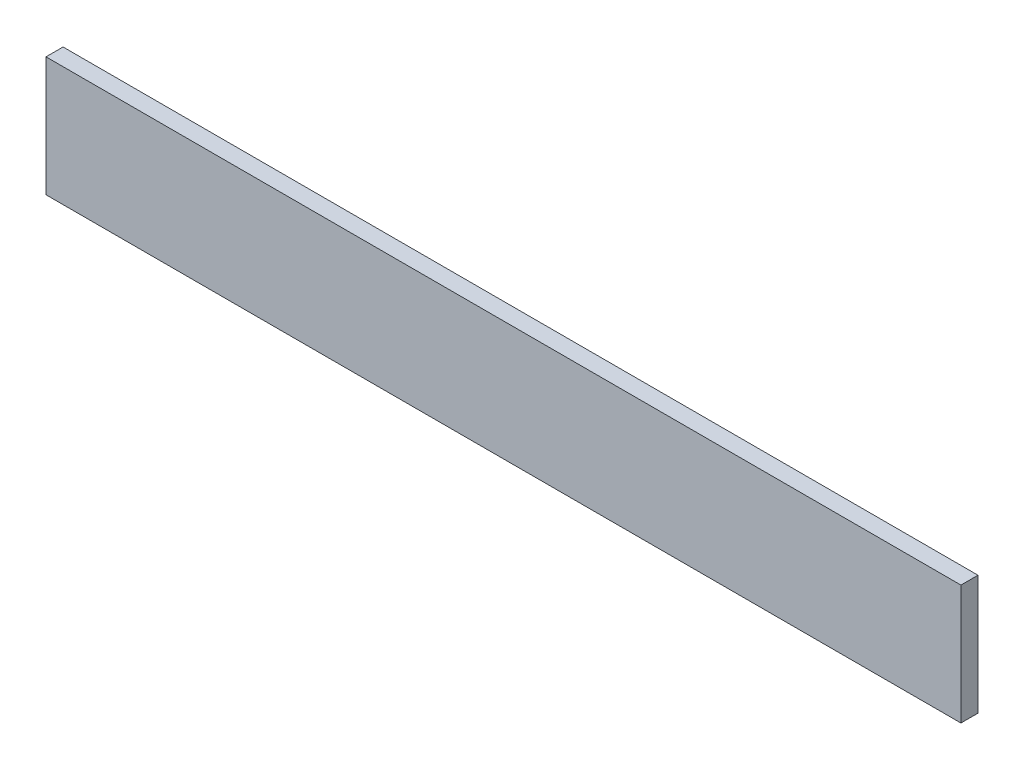
ISO-10303-21;
HEADER;
FILE_DESCRIPTION(('STEP AP214'),'2;1');
FILE_NAME('part.step','',(''),(''),'','','');
FILE_SCHEMA(('AUTOMOTIVE_DESIGN { 1 0 10303 214 1 1 1 1 }'));
ENDSEC;
DATA;
#1=APPLICATION_CONTEXT('core data for automotive mechanical design processes');
#2=APPLICATION_PROTOCOL_DEFINITION('international standard','automotive_design',2000,#1);
#3=PRODUCT_CONTEXT('',#1,'mechanical');
#4=PRODUCT('Part','Part','',(#3));
#5=PRODUCT_RELATED_PRODUCT_CATEGORY('part','',(#4));
#6=PRODUCT_DEFINITION_FORMATION('','',#4);
#7=PRODUCT_DEFINITION_CONTEXT('part definition',#1,'design');
#8=PRODUCT_DEFINITION('design','',#6,#7);
#9=PRODUCT_DEFINITION_SHAPE('','',#8);
#10=(LENGTH_UNIT() NAMED_UNIT(*) SI_UNIT(.MILLI.,.METRE.));
#11=(NAMED_UNIT(*) PLANE_ANGLE_UNIT() SI_UNIT($,.RADIAN.));
#12=(NAMED_UNIT(*) SI_UNIT($,.STERADIAN.) SOLID_ANGLE_UNIT());
#13=UNCERTAINTY_MEASURE_WITH_UNIT(LENGTH_MEASURE(1.E-05),#10,'distance_accuracy_value','');
#14=(GEOMETRIC_REPRESENTATION_CONTEXT(3) GLOBAL_UNCERTAINTY_ASSIGNED_CONTEXT((#13)) GLOBAL_UNIT_ASSIGNED_CONTEXT((#10,
#11,#12)) REPRESENTATION_CONTEXT('',''));
#15=CARTESIAN_POINT('',(0.,0.,0.));
#16=DIRECTION('',(0.,0.,1.));
#17=DIRECTION('',(1.,0.,0.));
#18=AXIS2_PLACEMENT_3D('',#15,#16,#17);
#19=CARTESIAN_POINT('',(268.,35.,-10.));
#20=DIRECTION('',(1.,0.,0.));
#21=DIRECTION('',(0.,0.,-1.));
#22=AXIS2_PLACEMENT_3D('',#19,#20,#21);
#23=PLANE('',#22);
#24=DIRECTION('',(0.,1.,0.));
#25=VECTOR('',#24,1.);
#26=CARTESIAN_POINT('',(268.,35.,0.));
#27=LINE('',#26,#25);
#28=CARTESIAN_POINT('',(268.,-35.,0.));
#29=VERTEX_POINT('',#28);
#30=CARTESIAN_POINT('',(268.,35.,0.));
#31=VERTEX_POINT('',#30);
#32=EDGE_CURVE('E100',#29,#31,#27,.T.);
#33=ORIENTED_EDGE('',*,*,#32,.F.);
#34=DIRECTION('',(0.,0.,1.));
#35=VECTOR('',#34,1.);
#36=CARTESIAN_POINT('',(268.,-35.,-10.));
#37=LINE('',#36,#35);
#38=CARTESIAN_POINT('',(268.,-35.,-10.));
#39=VERTEX_POINT('',#38);
#40=EDGE_CURVE('E11',#39,#29,#37,.T.);
#41=ORIENTED_EDGE('',*,*,#40,.F.);
#42=DIRECTION('',(0.,1.,0.));
#43=VECTOR('',#42,1.);
#44=CARTESIAN_POINT('',(268.,35.,-10.));
#45=LINE('',#44,#43);
#46=CARTESIAN_POINT('',(268.,35.,-10.));
#47=VERTEX_POINT('',#46);
#48=EDGE_CURVE('E94',#39,#47,#45,.T.);
#49=ORIENTED_EDGE('',*,*,#48,.T.);
#50=DIRECTION('',(0.,0.,1.));
#51=VECTOR('',#50,1.);
#52=CARTESIAN_POINT('',(268.,35.,-10.));
#53=LINE('',#52,#51);
#54=EDGE_CURVE('E39',#47,#31,#53,.T.);
#55=ORIENTED_EDGE('',*,*,#54,.T.);
#56=EDGE_LOOP('',(#33,#41,#49,#55));
#57=FACE_BOUND('',#56,.T.);
#58=ADVANCED_FACE('F36',(#57),#23,.T.);
#59=CARTESIAN_POINT('',(-268.,-35.,-10.));
#60=DIRECTION('',(0.,-1.,0.));
#61=DIRECTION('',(0.,0.,-1.));
#62=AXIS2_PLACEMENT_3D('',#59,#60,#61);
#63=PLANE('',#62);
#64=DIRECTION('',(1.,0.,0.));
#65=VECTOR('',#64,1.);
#66=CARTESIAN_POINT('',(-268.,-35.,0.));
#67=LINE('',#66,#65);
#68=CARTESIAN_POINT('',(-268.,-35.,0.));
#69=VERTEX_POINT('',#68);
#70=EDGE_CURVE('E96',#69,#29,#67,.T.);
#71=ORIENTED_EDGE('',*,*,#70,.F.);
#72=DIRECTION('',(0.,0.,1.));
#73=VECTOR('',#72,1.);
#74=CARTESIAN_POINT('',(-268.,-35.,-10.));
#75=LINE('',#74,#73);
#76=CARTESIAN_POINT('',(-268.,-35.,-10.));
#77=VERTEX_POINT('',#76);
#78=EDGE_CURVE('E45',#77,#69,#75,.T.);
#79=ORIENTED_EDGE('',*,*,#78,.F.);
#80=DIRECTION('',(1.,0.,0.));
#81=VECTOR('',#80,1.);
#82=CARTESIAN_POINT('',(-268.,-35.,-10.));
#83=LINE('',#82,#81);
#84=EDGE_CURVE('E91',#77,#39,#83,.T.);
#85=ORIENTED_EDGE('',*,*,#84,.T.);
#86=ORIENTED_EDGE('',*,*,#40,.T.);
#87=EDGE_LOOP('',(#71,#79,#85,#86));
#88=FACE_BOUND('',#87,.T.);
#89=ADVANCED_FACE('F110',(#88),#63,.T.);
#90=CARTESIAN_POINT('',(-268.,35.,-10.));
#91=DIRECTION('',(-1.,0.,0.));
#92=DIRECTION('',(0.,-1.,0.));
#93=AXIS2_PLACEMENT_3D('',#90,#91,#92);
#94=PLANE('',#93);
#95=DIRECTION('',(0.,-1.,0.));
#96=VECTOR('',#95,1.);
#97=CARTESIAN_POINT('',(-268.,35.,0.));
#98=LINE('',#97,#96);
#99=CARTESIAN_POINT('',(-268.,35.,0.));
#100=VERTEX_POINT('',#99);
#101=EDGE_CURVE('E86',#100,#69,#98,.T.);
#102=ORIENTED_EDGE('',*,*,#101,.F.);
#103=DIRECTION('',(0.,0.,1.));
#104=VECTOR('',#103,1.);
#105=CARTESIAN_POINT('',(-268.,35.,-10.));
#106=LINE('',#105,#104);
#107=CARTESIAN_POINT('',(-268.,35.,-10.));
#108=VERTEX_POINT('',#107);
#109=EDGE_CURVE('E81',#108,#100,#106,.T.);
#110=ORIENTED_EDGE('',*,*,#109,.F.);
#111=DIRECTION('',(0.,-1.,0.));
#112=VECTOR('',#111,1.);
#113=CARTESIAN_POINT('',(-268.,35.,-10.));
#114=LINE('',#113,#112);
#115=EDGE_CURVE('E84',#108,#77,#114,.T.);
#116=ORIENTED_EDGE('',*,*,#115,.T.);
#117=ORIENTED_EDGE('',*,*,#78,.T.);
#118=EDGE_LOOP('',(#102,#110,#116,#117));
#119=FACE_BOUND('',#118,.T.);
#120=ADVANCED_FACE('F83',(#119),#94,.T.);
#121=CARTESIAN_POINT('',(-268.,35.,-10.));
#122=DIRECTION('',(0.,1.,0.));
#123=DIRECTION('',(0.,0.,1.));
#124=AXIS2_PLACEMENT_3D('',#121,#122,#123);
#125=PLANE('',#124);
#126=DIRECTION('',(-1.,0.,0.));
#127=VECTOR('',#126,1.);
#128=CARTESIAN_POINT('',(-268.,35.,0.));
#129=LINE('',#128,#127);
#130=EDGE_CURVE('E103',#31,#100,#129,.T.);
#131=ORIENTED_EDGE('',*,*,#130,.F.);
#132=ORIENTED_EDGE('',*,*,#54,.F.);
#133=DIRECTION('',(-1.,0.,0.));
#134=VECTOR('',#133,1.);
#135=CARTESIAN_POINT('',(-268.,35.,-10.));
#136=LINE('',#135,#134);
#137=EDGE_CURVE('E90',#47,#108,#136,.T.);
#138=ORIENTED_EDGE('',*,*,#137,.T.);
#139=ORIENTED_EDGE('',*,*,#109,.T.);
#140=EDGE_LOOP('',(#131,#132,#138,#139));
#141=FACE_BOUND('',#140,.T.);
#142=ADVANCED_FACE('F93',(#141),#125,.T.);
#143=CARTESIAN_POINT('',(0.,0.,-10.));
#144=DIRECTION('',(0.,0.,1.));
#145=DIRECTION('',(1.,0.,0.));
#146=AXIS2_PLACEMENT_3D('',#143,#144,#145);
#147=PLANE('',#146);
#148=ORIENTED_EDGE('',*,*,#48,.F.);
#149=ORIENTED_EDGE('',*,*,#84,.F.);
#150=ORIENTED_EDGE('',*,*,#115,.F.);
#151=ORIENTED_EDGE('',*,*,#137,.F.);
#152=EDGE_LOOP('',(#148,#149,#150,#151));
#153=FACE_BOUND('',#152,.T.);
#154=ADVANCED_FACE('F89',(#153),#147,.F.);
#155=CARTESIAN_POINT('',(0.,0.,0.));
#156=DIRECTION('',(0.,0.,1.));
#157=DIRECTION('',(1.,0.,0.));
#158=AXIS2_PLACEMENT_3D('',#155,#156,#157);
#159=PLANE('',#158);
#160=ORIENTED_EDGE('',*,*,#32,.T.);
#161=ORIENTED_EDGE('',*,*,#130,.T.);
#162=ORIENTED_EDGE('',*,*,#101,.T.);
#163=ORIENTED_EDGE('',*,*,#70,.T.);
#164=EDGE_LOOP('',(#160,#161,#162,#163));
#165=FACE_BOUND('',#164,.T.);
#166=ADVANCED_FACE('F109',(#165),#159,.T.);
#167=CLOSED_SHELL('',(#58,#89,#120,#142,#154,#166));
#168=MANIFOLD_SOLID_BREP('B2',#167);
#169=ADVANCED_BREP_SHAPE_REPRESENTATION('',(#18,#168),#14);
#170=SHAPE_DEFINITION_REPRESENTATION(#9,#169);
ENDSEC;
END-ISO-10303-21;
